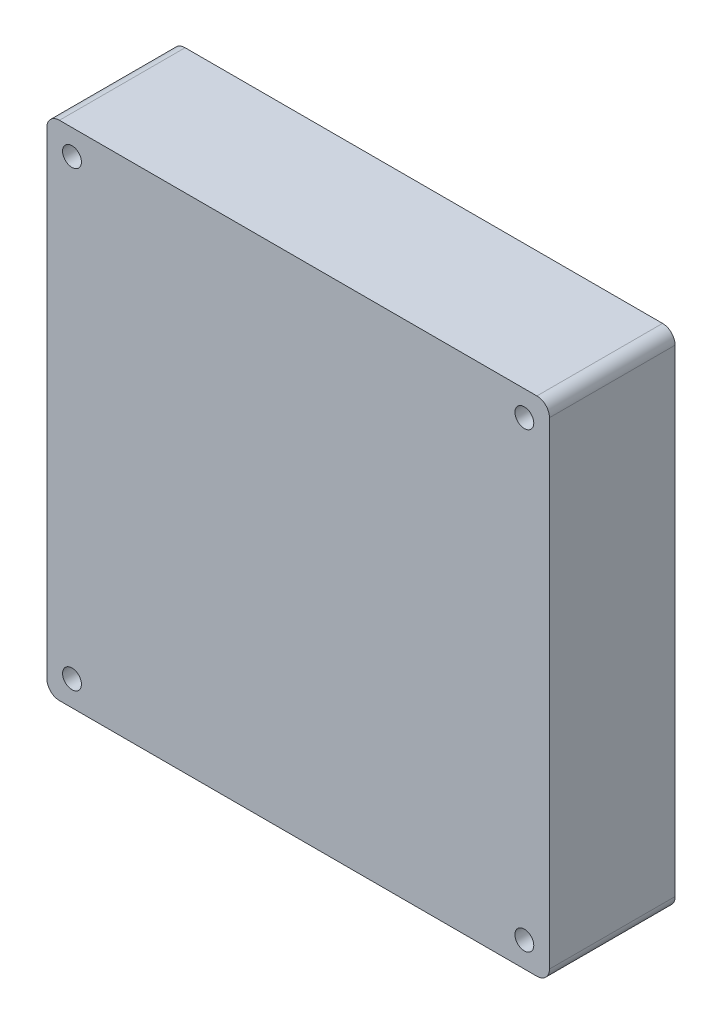
ISO-10303-21;
HEADER;
FILE_DESCRIPTION(('STEP AP214'),'2;1');
FILE_NAME('part.step','',(''),(''),'','','');
FILE_SCHEMA(('AUTOMOTIVE_DESIGN { 1 0 10303 214 1 1 1 1 }'));
ENDSEC;
DATA;
#1=APPLICATION_CONTEXT('core data for automotive mechanical design processes');
#2=APPLICATION_PROTOCOL_DEFINITION('international standard','automotive_design',2000,#1);
#3=PRODUCT_CONTEXT('',#1,'mechanical');
#4=PRODUCT('Part','Part','',(#3));
#5=PRODUCT_RELATED_PRODUCT_CATEGORY('part','',(#4));
#6=PRODUCT_DEFINITION_FORMATION('','',#4);
#7=PRODUCT_DEFINITION_CONTEXT('part definition',#1,'design');
#8=PRODUCT_DEFINITION('design','',#6,#7);
#9=PRODUCT_DEFINITION_SHAPE('','',#8);
#10=(LENGTH_UNIT() NAMED_UNIT(*) SI_UNIT(.MILLI.,.METRE.));
#11=(NAMED_UNIT(*) PLANE_ANGLE_UNIT() SI_UNIT($,.RADIAN.));
#12=(NAMED_UNIT(*) SI_UNIT($,.STERADIAN.) SOLID_ANGLE_UNIT());
#13=UNCERTAINTY_MEASURE_WITH_UNIT(LENGTH_MEASURE(1.E-05),#10,'distance_accuracy_value','');
#14=(GEOMETRIC_REPRESENTATION_CONTEXT(3) GLOBAL_UNCERTAINTY_ASSIGNED_CONTEXT((#13)) GLOBAL_UNIT_ASSIGNED_CONTEXT((#10,
#11,#12)) REPRESENTATION_CONTEXT('',''));
#15=CARTESIAN_POINT('',(0.,0.,0.));
#16=DIRECTION('',(0.,0.,1.));
#17=DIRECTION('',(1.,0.,0.));
#18=AXIS2_PLACEMENT_3D('',#15,#16,#17);
#19=CARTESIAN_POINT('',(0.,0.,10.));
#20=DIRECTION('',(-1.,0.,0.));
#21=DIRECTION('',(0.,-1.,0.));
#22=AXIS2_PLACEMENT_3D('',#19,#20,#21);
#23=PLANE('',#22);
#24=DIRECTION('',(0.,1.,0.));
#25=VECTOR('',#24,1.);
#26=CARTESIAN_POINT('',(0.,0.,10.));
#27=LINE('',#26,#25);
#28=CARTESIAN_POINT('',(0.,1.,10.));
#29=VERTEX_POINT('',#28);
#30=CARTESIAN_POINT('',(0.,39.,10.));
#31=VERTEX_POINT('',#30);
#32=EDGE_CURVE('E118',#29,#31,#27,.T.);
#33=ORIENTED_EDGE('',*,*,#32,.F.);
#34=DIRECTION('',(0.,0.,-1.));
#35=VECTOR('',#34,1.);
#36=CARTESIAN_POINT('',(0.,1.,10.));
#37=LINE('',#36,#35);
#38=CARTESIAN_POINT('',(0.,1.,0.));
#39=VERTEX_POINT('',#38);
#40=EDGE_CURVE('E103',#29,#39,#37,.T.);
#41=ORIENTED_EDGE('',*,*,#40,.T.);
#42=DIRECTION('',(0.,1.,0.));
#43=VECTOR('',#42,1.);
#44=CARTESIAN_POINT('',(0.,0.,0.));
#45=LINE('',#44,#43);
#46=CARTESIAN_POINT('',(0.,39.,0.));
#47=VERTEX_POINT('',#46);
#48=EDGE_CURVE('E115',#39,#47,#45,.T.);
#49=ORIENTED_EDGE('',*,*,#48,.T.);
#50=DIRECTION('',(0.,0.,-1.));
#51=VECTOR('',#50,1.);
#52=CARTESIAN_POINT('',(0.,39.,10.));
#53=LINE('',#52,#51);
#54=EDGE_CURVE('E120',#47,#31,#53,.F.);
#55=ORIENTED_EDGE('',*,*,#54,.T.);
#56=EDGE_LOOP('',(#33,#41,#49,#55));
#57=FACE_BOUND('',#56,.T.);
#58=ADVANCED_FACE('F33',(#57),#23,.F.);
#59=CARTESIAN_POINT('',(0.,40.,10.));
#60=DIRECTION('',(0.,-1.,0.));
#61=DIRECTION('',(1.,0.,0.));
#62=AXIS2_PLACEMENT_3D('',#59,#60,#61);
#63=PLANE('',#62);
#64=DIRECTION('',(-1.,0.,0.));
#65=VECTOR('',#64,1.);
#66=CARTESIAN_POINT('',(0.,40.,0.));
#67=LINE('',#66,#65);
#68=CARTESIAN_POINT('',(-0.999999999999999,40.,0.));
#69=VERTEX_POINT('',#68);
#70=CARTESIAN_POINT('',(-39.,40.,0.));
#71=VERTEX_POINT('',#70);
#72=EDGE_CURVE('E124',#69,#71,#67,.T.);
#73=ORIENTED_EDGE('',*,*,#72,.T.);
#74=DIRECTION('',(0.,0.,-1.));
#75=VECTOR('',#74,1.);
#76=CARTESIAN_POINT('',(-39.,40.,10.));
#77=LINE('',#76,#75);
#78=CARTESIAN_POINT('',(-39.,40.,10.));
#79=VERTEX_POINT('',#78);
#80=EDGE_CURVE('E11',#71,#79,#77,.F.);
#81=ORIENTED_EDGE('',*,*,#80,.T.);
#82=DIRECTION('',(-1.,0.,0.));
#83=VECTOR('',#82,1.);
#84=CARTESIAN_POINT('',(0.,40.,10.));
#85=LINE('',#84,#83);
#86=CARTESIAN_POINT('',(-0.999999999999999,40.,10.));
#87=VERTEX_POINT('',#86);
#88=EDGE_CURVE('E164',#87,#79,#85,.T.);
#89=ORIENTED_EDGE('',*,*,#88,.F.);
#90=DIRECTION('',(0.,0.,-1.));
#91=VECTOR('',#90,1.);
#92=CARTESIAN_POINT('',(-0.999999999999999,40.,10.));
#93=LINE('',#92,#91);
#94=EDGE_CURVE('E41',#87,#69,#93,.T.);
#95=ORIENTED_EDGE('',*,*,#94,.T.);
#96=EDGE_LOOP('',(#73,#81,#89,#95));
#97=FACE_BOUND('',#96,.T.);
#98=ADVANCED_FACE('F162',(#97),#63,.F.);
#99=CARTESIAN_POINT('',(-40.,0.,10.));
#100=DIRECTION('',(1.,0.,0.));
#101=DIRECTION('',(0.,0.,-1.));
#102=AXIS2_PLACEMENT_3D('',#99,#100,#101);
#103=PLANE('',#102);
#104=DIRECTION('',(0.,-1.,0.));
#105=VECTOR('',#104,1.);
#106=CARTESIAN_POINT('',(-40.,0.,0.));
#107=LINE('',#106,#105);
#108=CARTESIAN_POINT('',(-40.,39.,0.));
#109=VERTEX_POINT('',#108);
#110=CARTESIAN_POINT('',(-40.,0.999999999999997,0.));
#111=VERTEX_POINT('',#110);
#112=EDGE_CURVE('E128',#109,#111,#107,.T.);
#113=ORIENTED_EDGE('',*,*,#112,.T.);
#114=DIRECTION('',(0.,0.,-1.));
#115=VECTOR('',#114,1.);
#116=CARTESIAN_POINT('',(-40.,0.999999999999997,10.));
#117=LINE('',#116,#115);
#118=CARTESIAN_POINT('',(-40.,0.999999999999997,10.));
#119=VERTEX_POINT('',#118);
#120=EDGE_CURVE('E48',#111,#119,#117,.F.);
#121=ORIENTED_EDGE('',*,*,#120,.T.);
#122=DIRECTION('',(0.,-1.,0.));
#123=VECTOR('',#122,1.);
#124=CARTESIAN_POINT('',(-40.,0.,10.));
#125=LINE('',#124,#123);
#126=CARTESIAN_POINT('',(-40.,39.,10.));
#127=VERTEX_POINT('',#126);
#128=EDGE_CURVE('E172',#127,#119,#125,.T.);
#129=ORIENTED_EDGE('',*,*,#128,.F.);
#130=DIRECTION('',(0.,0.,-1.));
#131=VECTOR('',#130,1.);
#132=CARTESIAN_POINT('',(-40.,39.,10.));
#133=LINE('',#132,#131);
#134=EDGE_CURVE('E155',#127,#109,#133,.T.);
#135=ORIENTED_EDGE('',*,*,#134,.T.);
#136=EDGE_LOOP('',(#113,#121,#129,#135));
#137=FACE_BOUND('',#136,.T.);
#138=ADVANCED_FACE('F171',(#137),#103,.F.);
#139=CARTESIAN_POINT('',(0.,0.,10.));
#140=DIRECTION('',(0.,1.,0.));
#141=DIRECTION('',(-1.,0.,0.));
#142=AXIS2_PLACEMENT_3D('',#139,#140,#141);
#143=PLANE('',#142);
#144=DIRECTION('',(1.,0.,0.));
#145=VECTOR('',#144,1.);
#146=CARTESIAN_POINT('',(0.,0.,0.));
#147=LINE('',#146,#145);
#148=CARTESIAN_POINT('',(-39.,0.,0.));
#149=VERTEX_POINT('',#148);
#150=CARTESIAN_POINT('',(-1.,0.,0.));
#151=VERTEX_POINT('',#150);
#152=EDGE_CURVE('E138',#149,#151,#147,.T.);
#153=ORIENTED_EDGE('',*,*,#152,.T.);
#154=DIRECTION('',(0.,0.,-1.));
#155=VECTOR('',#154,1.);
#156=CARTESIAN_POINT('',(-1.,0.,10.));
#157=LINE('',#156,#155);
#158=CARTESIAN_POINT('',(-1.,0.,10.));
#159=VERTEX_POINT('',#158);
#160=EDGE_CURVE('E104',#151,#159,#157,.F.);
#161=ORIENTED_EDGE('',*,*,#160,.T.);
#162=DIRECTION('',(1.,0.,0.));
#163=VECTOR('',#162,1.);
#164=CARTESIAN_POINT('',(0.,0.,10.));
#165=LINE('',#164,#163);
#166=CARTESIAN_POINT('',(-39.,0.,10.));
#167=VERTEX_POINT('',#166);
#168=EDGE_CURVE('E134',#167,#159,#165,.T.);
#169=ORIENTED_EDGE('',*,*,#168,.F.);
#170=DIRECTION('',(0.,0.,-1.));
#171=VECTOR('',#170,1.);
#172=CARTESIAN_POINT('',(-39.,0.,10.));
#173=LINE('',#172,#171);
#174=EDGE_CURVE('E109',#167,#149,#173,.T.);
#175=ORIENTED_EDGE('',*,*,#174,.T.);
#176=EDGE_LOOP('',(#153,#161,#169,#175));
#177=FACE_BOUND('',#176,.T.);
#178=ADVANCED_FACE('F211',(#177),#143,.F.);
#179=CARTESIAN_POINT('',(0.,0.,10.));
#180=DIRECTION('',(0.,0.,1.));
#181=DIRECTION('',(1.,0.,0.));
#182=AXIS2_PLACEMENT_3D('',#179,#180,#181);
#183=PLANE('',#182);
#184=CARTESIAN_POINT('',(-38.,2.,10.));
#185=DIRECTION('',(0.,0.,1.));
#186=DIRECTION('',(1.,0.,0.));
#187=AXIS2_PLACEMENT_3D('',#184,#185,#186);
#188=CIRCLE('',#187,0.749999999999999);
#189=CARTESIAN_POINT('',(-37.25,2.,10.));
#190=VERTEX_POINT('',#189);
#191=EDGE_CURVE('E193',#190,#190,#188,.T.);
#192=ORIENTED_EDGE('',*,*,#191,.F.);
#193=EDGE_LOOP('',(#192));
#194=FACE_BOUND('',#193,.T.);
#195=CARTESIAN_POINT('',(-2.,2.,10.));
#196=DIRECTION('',(0.,0.,1.));
#197=DIRECTION('',(1.,0.,0.));
#198=AXIS2_PLACEMENT_3D('',#195,#196,#197);
#199=CIRCLE('',#198,0.75);
#200=CARTESIAN_POINT('',(-1.25,2.,10.));
#201=VERTEX_POINT('',#200);
#202=EDGE_CURVE('E187',#201,#201,#199,.T.);
#203=ORIENTED_EDGE('',*,*,#202,.F.);
#204=EDGE_LOOP('',(#203));
#205=FACE_BOUND('',#204,.T.);
#206=CARTESIAN_POINT('',(-2.,38.,10.));
#207=DIRECTION('',(0.,0.,1.));
#208=DIRECTION('',(1.,0.,0.));
#209=AXIS2_PLACEMENT_3D('',#206,#207,#208);
#210=CIRCLE('',#209,0.75);
#211=CARTESIAN_POINT('',(-1.25,38.,10.));
#212=VERTEX_POINT('',#211);
#213=EDGE_CURVE('E181',#212,#212,#210,.T.);
#214=ORIENTED_EDGE('',*,*,#213,.F.);
#215=EDGE_LOOP('',(#214));
#216=FACE_BOUND('',#215,.T.);
#217=CARTESIAN_POINT('',(-38.,38.,10.));
#218=DIRECTION('',(0.,0.,1.));
#219=DIRECTION('',(1.,0.,0.));
#220=AXIS2_PLACEMENT_3D('',#217,#218,#219);
#221=CIRCLE('',#220,0.749999999999999);
#222=CARTESIAN_POINT('',(-37.25,38.,10.));
#223=VERTEX_POINT('',#222);
#224=EDGE_CURVE('E131',#223,#223,#221,.T.);
#225=ORIENTED_EDGE('',*,*,#224,.F.);
#226=EDGE_LOOP('',(#225));
#227=FACE_BOUND('',#226,.T.);
#228=ORIENTED_EDGE('',*,*,#168,.T.);
#229=CARTESIAN_POINT('',(-1.,1.,10.));
#230=DIRECTION('',(0.,0.,1.));
#231=DIRECTION('',(1.,0.,0.));
#232=AXIS2_PLACEMENT_3D('',#229,#230,#231);
#233=CIRCLE('',#232,1.);
#234=EDGE_CURVE('E153',#159,#29,#233,.T.);
#235=ORIENTED_EDGE('',*,*,#234,.T.);
#236=ORIENTED_EDGE('',*,*,#32,.T.);
#237=CARTESIAN_POINT('',(-0.999999999999999,39.,10.));
#238=DIRECTION('',(0.,0.,1.));
#239=DIRECTION('',(1.,0.,0.));
#240=AXIS2_PLACEMENT_3D('',#237,#238,#239);
#241=CIRCLE('',#240,1.);
#242=EDGE_CURVE('E148',#31,#87,#241,.T.);
#243=ORIENTED_EDGE('',*,*,#242,.T.);
#244=ORIENTED_EDGE('',*,*,#88,.T.);
#245=CARTESIAN_POINT('',(-39.,39.,10.));
#246=DIRECTION('',(0.,0.,1.));
#247=DIRECTION('',(1.,0.,0.));
#248=AXIS2_PLACEMENT_3D('',#245,#246,#247);
#249=CIRCLE('',#248,1.);
#250=EDGE_CURVE('E55',#79,#127,#249,.T.);
#251=ORIENTED_EDGE('',*,*,#250,.T.);
#252=ORIENTED_EDGE('',*,*,#128,.T.);
#253=CARTESIAN_POINT('',(-39.,0.999999999999997,10.));
#254=DIRECTION('',(0.,0.,1.));
#255=DIRECTION('',(1.,0.,0.));
#256=AXIS2_PLACEMENT_3D('',#253,#254,#255);
#257=CIRCLE('',#256,1.);
#258=EDGE_CURVE('E151',#119,#167,#257,.T.);
#259=ORIENTED_EDGE('',*,*,#258,.T.);
#260=EDGE_LOOP('',(#228,#235,#236,#243,#244,#251,#252,#259));
#261=FACE_BOUND('',#260,.T.);
#262=ADVANCED_FACE('F208',(#194,#205,#216,#227,#261),#183,.T.);
#263=CARTESIAN_POINT('',(0.,0.,0.));
#264=DIRECTION('',(0.,0.,1.));
#265=DIRECTION('',(1.,0.,0.));
#266=AXIS2_PLACEMENT_3D('',#263,#264,#265);
#267=PLANE('',#266);
#268=CARTESIAN_POINT('',(-38.,2.,0.));
#269=DIRECTION('',(0.,0.,1.));
#270=DIRECTION('',(1.,0.,0.));
#271=AXIS2_PLACEMENT_3D('',#268,#269,#270);
#272=CIRCLE('',#271,0.749999999999999);
#273=CARTESIAN_POINT('',(-37.25,2.,0.));
#274=VERTEX_POINT('',#273);
#275=EDGE_CURVE('E190',#274,#274,#272,.T.);
#276=ORIENTED_EDGE('',*,*,#275,.T.);
#277=EDGE_LOOP('',(#276));
#278=FACE_BOUND('',#277,.T.);
#279=CARTESIAN_POINT('',(-2.,2.,0.));
#280=DIRECTION('',(0.,0.,1.));
#281=DIRECTION('',(1.,0.,0.));
#282=AXIS2_PLACEMENT_3D('',#279,#280,#281);
#283=CIRCLE('',#282,0.75);
#284=CARTESIAN_POINT('',(-1.25,2.,0.));
#285=VERTEX_POINT('',#284);
#286=EDGE_CURVE('E184',#285,#285,#283,.T.);
#287=ORIENTED_EDGE('',*,*,#286,.T.);
#288=EDGE_LOOP('',(#287));
#289=FACE_BOUND('',#288,.T.);
#290=CARTESIAN_POINT('',(-2.,38.,0.));
#291=DIRECTION('',(0.,0.,1.));
#292=DIRECTION('',(1.,0.,0.));
#293=AXIS2_PLACEMENT_3D('',#290,#291,#292);
#294=CIRCLE('',#293,0.75);
#295=CARTESIAN_POINT('',(-1.25,38.,0.));
#296=VERTEX_POINT('',#295);
#297=EDGE_CURVE('E179',#296,#296,#294,.T.);
#298=ORIENTED_EDGE('',*,*,#297,.T.);
#299=EDGE_LOOP('',(#298));
#300=FACE_BOUND('',#299,.T.);
#301=CARTESIAN_POINT('',(-38.,38.,0.));
#302=DIRECTION('',(0.,0.,1.));
#303=DIRECTION('',(1.,0.,0.));
#304=AXIS2_PLACEMENT_3D('',#301,#302,#303);
#305=CIRCLE('',#304,0.749999999999999);
#306=CARTESIAN_POINT('',(-37.25,38.,0.));
#307=VERTEX_POINT('',#306);
#308=EDGE_CURVE('E125',#307,#307,#305,.T.);
#309=ORIENTED_EDGE('',*,*,#308,.T.);
#310=EDGE_LOOP('',(#309));
#311=FACE_BOUND('',#310,.T.);
#312=ORIENTED_EDGE('',*,*,#48,.F.);
#313=CARTESIAN_POINT('',(-1.,1.,0.));
#314=DIRECTION('',(0.,0.,1.));
#315=DIRECTION('',(1.,0.,0.));
#316=AXIS2_PLACEMENT_3D('',#313,#314,#315);
#317=CIRCLE('',#316,1.);
#318=EDGE_CURVE('E99',#39,#151,#317,.F.);
#319=ORIENTED_EDGE('',*,*,#318,.T.);
#320=ORIENTED_EDGE('',*,*,#152,.F.);
#321=CARTESIAN_POINT('',(-39.,0.999999999999997,0.));
#322=DIRECTION('',(0.,0.,1.));
#323=DIRECTION('',(1.,0.,0.));
#324=AXIS2_PLACEMENT_3D('',#321,#322,#323);
#325=CIRCLE('',#324,1.);
#326=EDGE_CURVE('E110',#149,#111,#325,.F.);
#327=ORIENTED_EDGE('',*,*,#326,.T.);
#328=ORIENTED_EDGE('',*,*,#112,.F.);
#329=CARTESIAN_POINT('',(-39.,39.,0.));
#330=DIRECTION('',(0.,0.,1.));
#331=DIRECTION('',(1.,0.,0.));
#332=AXIS2_PLACEMENT_3D('',#329,#330,#331);
#333=CIRCLE('',#332,1.);
#334=EDGE_CURVE('E142',#109,#71,#333,.F.);
#335=ORIENTED_EDGE('',*,*,#334,.T.);
#336=ORIENTED_EDGE('',*,*,#72,.F.);
#337=CARTESIAN_POINT('',(-0.999999999999999,39.,0.));
#338=DIRECTION('',(0.,0.,1.));
#339=DIRECTION('',(1.,0.,0.));
#340=AXIS2_PLACEMENT_3D('',#337,#338,#339);
#341=CIRCLE('',#340,1.);
#342=EDGE_CURVE('E119',#69,#47,#341,.F.);
#343=ORIENTED_EDGE('',*,*,#342,.T.);
#344=EDGE_LOOP('',(#312,#319,#320,#327,#328,#335,#336,#343));
#345=FACE_BOUND('',#344,.T.);
#346=ADVANCED_FACE('F122',(#278,#289,#300,#311,#345),#267,.F.);
#347=CARTESIAN_POINT('',(-38.,38.,0.));
#348=DIRECTION('',(0.,0.,1.));
#349=DIRECTION('',(1.,0.,0.));
#350=AXIS2_PLACEMENT_3D('',#347,#348,#349);
#351=CYLINDRICAL_SURFACE('',#350,0.749999999999999);
#352=ORIENTED_EDGE('',*,*,#308,.F.);
#353=EDGE_LOOP('',(#352));
#354=FACE_BOUND('',#353,.T.);
#355=ORIENTED_EDGE('',*,*,#224,.T.);
#356=EDGE_LOOP('',(#355));
#357=FACE_BOUND('',#356,.T.);
#358=ADVANCED_FACE('F242',(#354,#357),#351,.F.);
#359=CARTESIAN_POINT('',(-2.,38.,0.));
#360=DIRECTION('',(0.,0.,1.));
#361=DIRECTION('',(1.,0.,0.));
#362=AXIS2_PLACEMENT_3D('',#359,#360,#361);
#363=CYLINDRICAL_SURFACE('',#362,0.75);
#364=ORIENTED_EDGE('',*,*,#297,.F.);
#365=EDGE_LOOP('',(#364));
#366=FACE_BOUND('',#365,.T.);
#367=ORIENTED_EDGE('',*,*,#213,.T.);
#368=EDGE_LOOP('',(#367));
#369=FACE_BOUND('',#368,.T.);
#370=ADVANCED_FACE('F246',(#366,#369),#363,.F.);
#371=CARTESIAN_POINT('',(-2.,2.,0.));
#372=DIRECTION('',(0.,0.,1.));
#373=DIRECTION('',(1.,0.,0.));
#374=AXIS2_PLACEMENT_3D('',#371,#372,#373);
#375=CYLINDRICAL_SURFACE('',#374,0.75);
#376=ORIENTED_EDGE('',*,*,#286,.F.);
#377=EDGE_LOOP('',(#376));
#378=FACE_BOUND('',#377,.T.);
#379=ORIENTED_EDGE('',*,*,#202,.T.);
#380=EDGE_LOOP('',(#379));
#381=FACE_BOUND('',#380,.T.);
#382=ADVANCED_FACE('F204',(#378,#381),#375,.F.);
#383=CARTESIAN_POINT('',(-38.,2.,0.));
#384=DIRECTION('',(0.,0.,1.));
#385=DIRECTION('',(1.,0.,0.));
#386=AXIS2_PLACEMENT_3D('',#383,#384,#385);
#387=CYLINDRICAL_SURFACE('',#386,0.749999999999999);
#388=ORIENTED_EDGE('',*,*,#275,.F.);
#389=EDGE_LOOP('',(#388));
#390=FACE_BOUND('',#389,.T.);
#391=ORIENTED_EDGE('',*,*,#191,.T.);
#392=EDGE_LOOP('',(#391));
#393=FACE_BOUND('',#392,.T.);
#394=ADVANCED_FACE('F201',(#390,#393),#387,.F.);
#395=CARTESIAN_POINT('',(-1.,1.,10.));
#396=DIRECTION('',(0.,0.,-1.));
#397=DIRECTION('',(-1.,0.,0.));
#398=AXIS2_PLACEMENT_3D('',#395,#396,#397);
#399=CYLINDRICAL_SURFACE('',#398,1.);
#400=ORIENTED_EDGE('',*,*,#234,.F.);
#401=ORIENTED_EDGE('',*,*,#160,.F.);
#402=ORIENTED_EDGE('',*,*,#318,.F.);
#403=ORIENTED_EDGE('',*,*,#40,.F.);
#404=EDGE_LOOP('',(#400,#401,#402,#403));
#405=FACE_BOUND('',#404,.T.);
#406=ADVANCED_FACE('F102',(#405),#399,.T.);
#407=CARTESIAN_POINT('',(-39.,0.999999999999997,10.));
#408=DIRECTION('',(0.,0.,-1.));
#409=DIRECTION('',(-1.,0.,0.));
#410=AXIS2_PLACEMENT_3D('',#407,#408,#409);
#411=CYLINDRICAL_SURFACE('',#410,1.);
#412=ORIENTED_EDGE('',*,*,#258,.F.);
#413=ORIENTED_EDGE('',*,*,#120,.F.);
#414=ORIENTED_EDGE('',*,*,#326,.F.);
#415=ORIENTED_EDGE('',*,*,#174,.F.);
#416=EDGE_LOOP('',(#412,#413,#414,#415));
#417=FACE_BOUND('',#416,.T.);
#418=ADVANCED_FACE('F222',(#417),#411,.T.);
#419=CARTESIAN_POINT('',(-39.,39.,10.));
#420=DIRECTION('',(0.,0.,-1.));
#421=DIRECTION('',(-1.,0.,0.));
#422=AXIS2_PLACEMENT_3D('',#419,#420,#421);
#423=CYLINDRICAL_SURFACE('',#422,1.);
#424=ORIENTED_EDGE('',*,*,#250,.F.);
#425=ORIENTED_EDGE('',*,*,#80,.F.);
#426=ORIENTED_EDGE('',*,*,#334,.F.);
#427=ORIENTED_EDGE('',*,*,#134,.F.);
#428=EDGE_LOOP('',(#424,#425,#426,#427));
#429=FACE_BOUND('',#428,.T.);
#430=ADVANCED_FACE('F170',(#429),#423,.T.);
#431=CARTESIAN_POINT('',(-0.999999999999999,39.,10.));
#432=DIRECTION('',(0.,0.,-1.));
#433=DIRECTION('',(-1.,0.,0.));
#434=AXIS2_PLACEMENT_3D('',#431,#432,#433);
#435=CYLINDRICAL_SURFACE('',#434,1.);
#436=ORIENTED_EDGE('',*,*,#242,.F.);
#437=ORIENTED_EDGE('',*,*,#54,.F.);
#438=ORIENTED_EDGE('',*,*,#342,.F.);
#439=ORIENTED_EDGE('',*,*,#94,.F.);
#440=EDGE_LOOP('',(#436,#437,#438,#439));
#441=FACE_BOUND('',#440,.T.);
#442=ADVANCED_FACE('F35',(#441),#435,.T.);
#443=CLOSED_SHELL('',(#58,#98,#138,#178,#262,#346,#358,#370,#382,#394,#406,#418,#430,#442));
#444=MANIFOLD_SOLID_BREP('B2',#443);
#445=ADVANCED_BREP_SHAPE_REPRESENTATION('',(#18,#444),#14);
#446=SHAPE_DEFINITION_REPRESENTATION(#9,#445);
ENDSEC;
END-ISO-10303-21;
